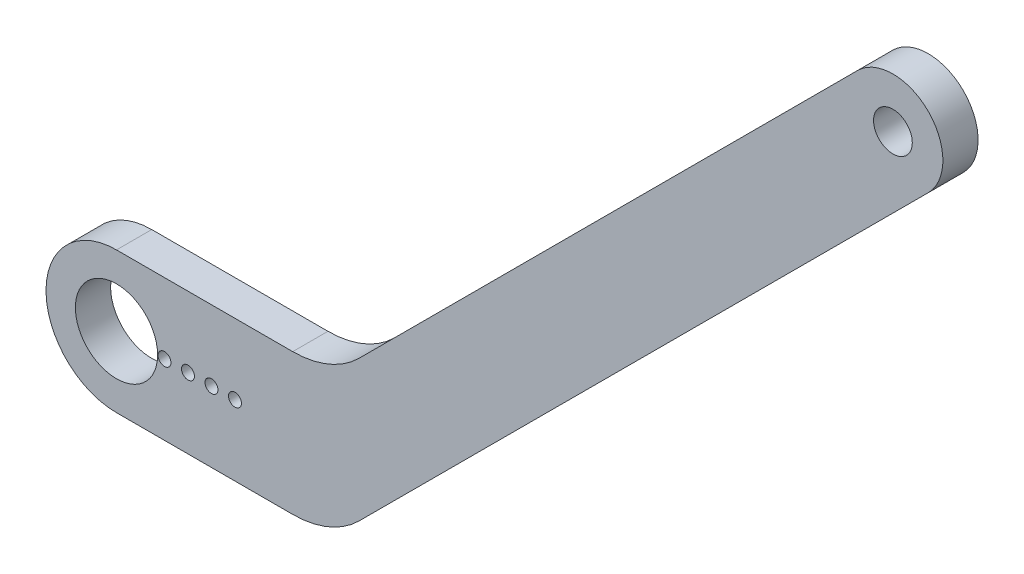
ISO-10303-21;
HEADER;
FILE_DESCRIPTION(('STEP AP214'),'2;1');
FILE_NAME('part.step','',(''),(''),'','','');
FILE_SCHEMA(('AUTOMOTIVE_DESIGN { 1 0 10303 214 1 1 1 1 }'));
ENDSEC;
DATA;
#1=APPLICATION_CONTEXT('core data for automotive mechanical design processes');
#2=APPLICATION_PROTOCOL_DEFINITION('international standard','automotive_design',2000,#1);
#3=PRODUCT_CONTEXT('',#1,'mechanical');
#4=PRODUCT('Part','Part','',(#3));
#5=PRODUCT_RELATED_PRODUCT_CATEGORY('part','',(#4));
#6=PRODUCT_DEFINITION_FORMATION('','',#4);
#7=PRODUCT_DEFINITION_CONTEXT('part definition',#1,'design');
#8=PRODUCT_DEFINITION('design','',#6,#7);
#9=PRODUCT_DEFINITION_SHAPE('','',#8);
#10=(LENGTH_UNIT() NAMED_UNIT(*) SI_UNIT(.MILLI.,.METRE.));
#11=(NAMED_UNIT(*) PLANE_ANGLE_UNIT() SI_UNIT($,.RADIAN.));
#12=(NAMED_UNIT(*) SI_UNIT($,.STERADIAN.) SOLID_ANGLE_UNIT());
#13=UNCERTAINTY_MEASURE_WITH_UNIT(LENGTH_MEASURE(1.E-05),#10,'distance_accuracy_value','');
#14=(GEOMETRIC_REPRESENTATION_CONTEXT(3) GLOBAL_UNCERTAINTY_ASSIGNED_CONTEXT((#13)) GLOBAL_UNIT_ASSIGNED_CONTEXT((#10,
#11,#12)) REPRESENTATION_CONTEXT('',''));
#15=CARTESIAN_POINT('',(0.,0.,0.));
#16=DIRECTION('',(0.,0.,1.));
#17=DIRECTION('',(1.,0.,0.));
#18=AXIS2_PLACEMENT_3D('',#15,#16,#17);
#19=CARTESIAN_POINT('',(66.088464940728,47.7643488016577,3.));
#20=DIRECTION('',(0.,0.,-1.));
#21=DIRECTION('',(-1.,0.,0.));
#22=AXIS2_PLACEMENT_3D('',#19,#20,#21);
#23=CYLINDRICAL_SURFACE('',#22,4.25000000000001);
#24=CARTESIAN_POINT('',(66.088464940728,47.7643488016577,0.));
#25=DIRECTION('',(0.,0.,1.));
#26=DIRECTION('',(1.,0.,0.));
#27=AXIS2_PLACEMENT_3D('',#24,#25,#26);
#28=CIRCLE('',#27,4.25000000000001);
#29=CARTESIAN_POINT('',(63.0832611206852,50.7695526217005,0.));
#30=VERTEX_POINT('',#29);
#31=CARTESIAN_POINT('',(69.0936687607709,44.7591449816148,0.));
#32=VERTEX_POINT('',#31);
#33=EDGE_CURVE('E145',#30,#32,#28,.F.);
#34=ORIENTED_EDGE('',*,*,#33,.F.);
#35=DIRECTION('',(0.,0.,-1.));
#36=VECTOR('',#35,1.);
#37=CARTESIAN_POINT('',(63.0832611206852,50.7695526217005,3.));
#38=LINE('',#37,#36);
#39=CARTESIAN_POINT('',(63.0832611206852,50.7695526217005,3.));
#40=VERTEX_POINT('',#39);
#41=EDGE_CURVE('E11',#40,#30,#38,.T.);
#42=ORIENTED_EDGE('',*,*,#41,.F.);
#43=CARTESIAN_POINT('',(66.088464940728,47.7643488016577,3.));
#44=DIRECTION('',(0.,0.,1.));
#45=DIRECTION('',(1.,0.,0.));
#46=AXIS2_PLACEMENT_3D('',#43,#44,#45);
#47=CIRCLE('',#46,4.25000000000001);
#48=CARTESIAN_POINT('',(69.0936687607709,44.7591449816148,3.));
#49=VERTEX_POINT('',#48);
#50=EDGE_CURVE('E165',#40,#49,#47,.F.);
#51=ORIENTED_EDGE('',*,*,#50,.T.);
#52=DIRECTION('',(0.,0.,-1.));
#53=VECTOR('',#52,1.);
#54=CARTESIAN_POINT('',(69.0936687607709,44.7591449816148,3.));
#55=LINE('',#54,#53);
#56=EDGE_CURVE('E94',#49,#32,#55,.T.);
#57=ORIENTED_EDGE('',*,*,#56,.T.);
#58=EDGE_LOOP('',(#34,#42,#51,#57));
#59=FACE_BOUND('',#58,.T.);
#60=ADVANCED_FACE('F37',(#59),#23,.T.);
#61=CARTESIAN_POINT('',(6.15685424949239,-6.15685424949239,3.));
#62=DIRECTION('',(0.707106781186548,-0.707106781186547,0.));
#63=DIRECTION('',(0.707106781186547,0.707106781186548,0.));
#64=AXIS2_PLACEMENT_3D('',#61,#62,#63);
#65=PLANE('',#64);
#66=DIRECTION('',(-0.707106781186547,-0.707106781186548,0.));
#67=VECTOR('',#66,1.);
#68=CARTESIAN_POINT('',(6.15685424949239,-6.15685424949239,0.));
#69=LINE('',#68,#67);
#70=CARTESIAN_POINT('',(20.6568542494924,8.34314575050763,0.));
#71=VERTEX_POINT('',#70);
#72=EDGE_CURVE('E148',#30,#71,#69,.T.);
#73=ORIENTED_EDGE('',*,*,#72,.T.);
#74=DIRECTION('',(0.,0.,-1.));
#75=VECTOR('',#74,1.);
#76=CARTESIAN_POINT('',(20.6568542494924,8.34314575050763,3.));
#77=LINE('',#76,#75);
#78=CARTESIAN_POINT('',(20.6568542494924,8.34314575050763,3.));
#79=VERTEX_POINT('',#78);
#80=EDGE_CURVE('E45',#79,#71,#77,.T.);
#81=ORIENTED_EDGE('',*,*,#80,.F.);
#82=DIRECTION('',(-0.707106781186547,-0.707106781186548,0.));
#83=VECTOR('',#82,1.);
#84=CARTESIAN_POINT('',(6.15685424949239,-6.15685424949239,3.));
#85=LINE('',#84,#83);
#86=EDGE_CURVE('E224',#40,#79,#85,.T.);
#87=ORIENTED_EDGE('',*,*,#86,.F.);
#88=ORIENTED_EDGE('',*,*,#41,.T.);
#89=EDGE_LOOP('',(#73,#81,#87,#88));
#90=FACE_BOUND('',#89,.T.);
#91=ADVANCED_FACE('F254',(#90),#65,.F.);
#92=CARTESIAN_POINT('',(14.9997500117588,13.9997500007108,3.));
#93=DIRECTION('',(0.,0.,-1.));
#94=DIRECTION('',(-1.,0.,0.));
#95=AXIS2_PLACEMENT_3D('',#92,#93,#94);
#96=CYLINDRICAL_SURFACE('',#95,8.00000000000001);
#97=CARTESIAN_POINT('',(14.9997500117588,13.9997500007108,0.));
#98=DIRECTION('',(0.,0.,1.));
#99=DIRECTION('',(1.,0.,0.));
#100=AXIS2_PLACEMENT_3D('',#97,#98,#99);
#101=CIRCLE('',#100,8.00000000000001);
#102=CARTESIAN_POINT('',(14.9997500117588,5.99975000071084,0.));
#103=VERTEX_POINT('',#102);
#104=EDGE_CURVE('E152',#103,#71,#101,.T.);
#105=ORIENTED_EDGE('',*,*,#104,.F.);
#106=DIRECTION('',(0.,0.,-1.));
#107=VECTOR('',#106,1.);
#108=CARTESIAN_POINT('',(14.9997500117588,5.99975000071084,3.));
#109=LINE('',#108,#107);
#110=CARTESIAN_POINT('',(14.9997500117588,5.99975000071084,3.));
#111=VERTEX_POINT('',#110);
#112=EDGE_CURVE('E171',#111,#103,#109,.T.);
#113=ORIENTED_EDGE('',*,*,#112,.F.);
#114=CARTESIAN_POINT('',(14.9997500117588,13.9997500007108,3.));
#115=DIRECTION('',(0.,0.,1.));
#116=DIRECTION('',(1.,0.,0.));
#117=AXIS2_PLACEMENT_3D('',#114,#115,#116);
#118=CIRCLE('',#117,8.00000000000001);
#119=EDGE_CURVE('E226',#111,#79,#118,.T.);
#120=ORIENTED_EDGE('',*,*,#119,.T.);
#121=ORIENTED_EDGE('',*,*,#80,.T.);
#122=EDGE_LOOP('',(#105,#113,#120,#121));
#123=FACE_BOUND('',#122,.T.);
#124=ADVANCED_FACE('F238',(#123),#96,.F.);
#125=CARTESIAN_POINT('',(0.,5.99975000071084,3.));
#126=DIRECTION('',(0.,1.,0.));
#127=DIRECTION('',(-1.,0.,0.));
#128=AXIS2_PLACEMENT_3D('',#125,#126,#127);
#129=PLANE('',#128);
#130=DIRECTION('',(1.,0.,0.));
#131=VECTOR('',#130,1.);
#132=CARTESIAN_POINT('',(0.,5.99975000071084,0.));
#133=LINE('',#132,#131);
#134=CARTESIAN_POINT('',(0.000249999289151017,5.99975000071084,0.));
#135=VERTEX_POINT('',#134);
#136=EDGE_CURVE('E155',#135,#103,#133,.T.);
#137=ORIENTED_EDGE('',*,*,#136,.F.);
#138=DIRECTION('',(0.,0.,-1.));
#139=VECTOR('',#138,1.);
#140=CARTESIAN_POINT('',(0.000249999289151017,5.99975000071084,3.));
#141=LINE('',#140,#139);
#142=CARTESIAN_POINT('',(0.000249999289151017,5.99975000071084,3.));
#143=VERTEX_POINT('',#142);
#144=EDGE_CURVE('E169',#143,#135,#141,.T.);
#145=ORIENTED_EDGE('',*,*,#144,.F.);
#146=DIRECTION('',(1.,0.,0.));
#147=VECTOR('',#146,1.);
#148=CARTESIAN_POINT('',(0.,5.99975000071084,3.));
#149=LINE('',#148,#147);
#150=EDGE_CURVE('E229',#143,#111,#149,.T.);
#151=ORIENTED_EDGE('',*,*,#150,.T.);
#152=ORIENTED_EDGE('',*,*,#112,.T.);
#153=EDGE_LOOP('',(#137,#145,#151,#152));
#154=FACE_BOUND('',#153,.T.);
#155=ADVANCED_FACE('F233',(#154),#129,.T.);
#156=CARTESIAN_POINT('',(0.000249999289151017,-0.000249999289158823,3.));
#157=DIRECTION('',(0.,0.,-1.));
#158=DIRECTION('',(-1.,0.,0.));
#159=AXIS2_PLACEMENT_3D('',#156,#157,#158);
#160=CYLINDRICAL_SURFACE('',#159,6.);
#161=CARTESIAN_POINT('',(0.000249999289151017,-0.000249999289158823,0.));
#162=DIRECTION('',(0.,0.,1.));
#163=DIRECTION('',(1.,0.,0.));
#164=AXIS2_PLACEMENT_3D('',#161,#162,#163);
#165=CIRCLE('',#164,6.);
#166=CARTESIAN_POINT('',(0.000249999289151017,-6.00024999928916,0.));
#167=VERTEX_POINT('',#166);
#168=EDGE_CURVE('E158',#135,#167,#165,.T.);
#169=ORIENTED_EDGE('',*,*,#168,.T.);
#170=DIRECTION('',(0.,0.,-1.));
#171=VECTOR('',#170,1.);
#172=CARTESIAN_POINT('',(0.000249999289151017,-6.00024999928916,3.));
#173=LINE('',#172,#171);
#174=CARTESIAN_POINT('',(0.000249999289151017,-6.00024999928916,3.));
#175=VERTEX_POINT('',#174);
#176=EDGE_CURVE('E136',#175,#167,#173,.T.);
#177=ORIENTED_EDGE('',*,*,#176,.F.);
#178=CARTESIAN_POINT('',(0.000249999289151017,-0.000249999289158823,3.));
#179=DIRECTION('',(0.,0.,1.));
#180=DIRECTION('',(1.,0.,0.));
#181=AXIS2_PLACEMENT_3D('',#178,#179,#180);
#182=CIRCLE('',#181,6.);
#183=EDGE_CURVE('E124',#143,#175,#182,.T.);
#184=ORIENTED_EDGE('',*,*,#183,.F.);
#185=ORIENTED_EDGE('',*,*,#144,.T.);
#186=EDGE_LOOP('',(#169,#177,#184,#185));
#187=FACE_BOUND('',#186,.T.);
#188=ADVANCED_FACE('F244',(#187),#160,.T.);
#189=CARTESIAN_POINT('',(0.,-6.00024999928916,3.));
#190=DIRECTION('',(0.,1.,0.));
#191=DIRECTION('',(-1.,0.,0.));
#192=AXIS2_PLACEMENT_3D('',#189,#190,#191);
#193=PLANE('',#192);
#194=DIRECTION('',(1.,0.,0.));
#195=VECTOR('',#194,1.);
#196=CARTESIAN_POINT('',(0.,-6.00024999928916,0.));
#197=LINE('',#196,#195);
#198=CARTESIAN_POINT('',(14.9918677418608,-6.00024999928916,0.));
#199=VERTEX_POINT('',#198);
#200=EDGE_CURVE('E133',#167,#199,#197,.T.);
#201=ORIENTED_EDGE('',*,*,#200,.T.);
#202=DIRECTION('',(0.,0.,-1.));
#203=VECTOR('',#202,1.);
#204=CARTESIAN_POINT('',(14.9918677418608,-6.00024999928916,3.));
#205=LINE('',#204,#203);
#206=CARTESIAN_POINT('',(14.9918677418608,-6.00024999928916,3.));
#207=VERTEX_POINT('',#206);
#208=EDGE_CURVE('E130',#207,#199,#205,.T.);
#209=ORIENTED_EDGE('',*,*,#208,.F.);
#210=DIRECTION('',(1.,0.,0.));
#211=VECTOR('',#210,1.);
#212=CARTESIAN_POINT('',(0.,-6.00024999928916,3.));
#213=LINE('',#212,#211);
#214=EDGE_CURVE('E116',#175,#207,#213,.T.);
#215=ORIENTED_EDGE('',*,*,#214,.F.);
#216=ORIENTED_EDGE('',*,*,#176,.T.);
#217=EDGE_LOOP('',(#201,#209,#215,#216));
#218=FACE_BOUND('',#217,.T.);
#219=ADVANCED_FACE('F131',(#218),#193,.F.);
#220=CARTESIAN_POINT('',(14.9918677418608,1.99975000071084,3.));
#221=DIRECTION('',(0.,0.,-1.));
#222=DIRECTION('',(-1.,0.,0.));
#223=AXIS2_PLACEMENT_3D('',#220,#221,#222);
#224=CYLINDRICAL_SURFACE('',#223,8.00000000000001);
#225=CARTESIAN_POINT('',(14.9918677418608,1.99975000071084,0.));
#226=DIRECTION('',(0.,0.,1.));
#227=DIRECTION('',(1.,0.,0.));
#228=AXIS2_PLACEMENT_3D('',#225,#226,#227);
#229=CIRCLE('',#228,8.00000000000001);
#230=CARTESIAN_POINT('',(20.6470457883556,-3.65877995524446,0.));
#231=VERTEX_POINT('',#230);
#232=EDGE_CURVE('E161',#199,#231,#229,.T.);
#233=ORIENTED_EDGE('',*,*,#232,.T.);
#234=DIRECTION('',(0.,0.,-1.));
#235=VECTOR('',#234,1.);
#236=CARTESIAN_POINT('',(20.6470457883556,-3.65877995524446,3.));
#237=LINE('',#236,#235);
#238=CARTESIAN_POINT('',(20.6470457883556,-3.65877995524446,3.));
#239=VERTEX_POINT('',#238);
#240=EDGE_CURVE('E137',#239,#231,#237,.T.);
#241=ORIENTED_EDGE('',*,*,#240,.F.);
#242=CARTESIAN_POINT('',(14.9918677418608,1.99975000071084,3.));
#243=DIRECTION('',(0.,0.,1.));
#244=DIRECTION('',(1.,0.,0.));
#245=AXIS2_PLACEMENT_3D('',#242,#243,#244);
#246=CIRCLE('',#245,8.00000000000001);
#247=EDGE_CURVE('E120',#207,#239,#246,.T.);
#248=ORIENTED_EDGE('',*,*,#247,.F.);
#249=ORIENTED_EDGE('',*,*,#208,.T.);
#250=EDGE_LOOP('',(#233,#241,#248,#249));
#251=FACE_BOUND('',#250,.T.);
#252=ADVANCED_FACE('F139',(#251),#224,.T.);
#253=CARTESIAN_POINT('',(12.1467954560561,-12.1539950452236,3.));
#254=DIRECTION('',(-0.706897255811848,0.707316244494411,0.));
#255=DIRECTION('',(-0.707316244494412,-0.706897255811848,0.));
#256=AXIS2_PLACEMENT_3D('',#253,#254,#255);
#257=PLANE('',#256);
#258=DIRECTION('',(0.707316244494412,0.706897255811848,0.));
#259=VECTOR('',#258,1.);
#260=CARTESIAN_POINT('',(12.1467954560561,-12.1539950452236,0.));
#261=LINE('',#260,#259);
#262=EDGE_CURVE('E163',#231,#32,#261,.T.);
#263=ORIENTED_EDGE('',*,*,#262,.T.);
#264=ORIENTED_EDGE('',*,*,#56,.F.);
#265=DIRECTION('',(0.707316244494412,0.706897255811848,0.));
#266=VECTOR('',#265,1.);
#267=CARTESIAN_POINT('',(12.1467954560561,-12.1539950452236,3.));
#268=LINE('',#267,#266);
#269=EDGE_CURVE('E62',#239,#49,#268,.T.);
#270=ORIENTED_EDGE('',*,*,#269,.F.);
#271=ORIENTED_EDGE('',*,*,#240,.T.);
#272=EDGE_LOOP('',(#263,#264,#270,#271));
#273=FACE_BOUND('',#272,.T.);
#274=ADVANCED_FACE('F261',(#273),#257,.F.);
#275=CARTESIAN_POINT('',(0.,0.,3.));
#276=DIRECTION('',(0.,0.,1.));
#277=DIRECTION('',(1.,0.,0.));
#278=AXIS2_PLACEMENT_3D('',#275,#276,#277);
#279=PLANE('',#278);
#280=CARTESIAN_POINT('',(4.085,0.,3.));
#281=DIRECTION('',(0.,0.,1.));
#282=DIRECTION('',(1.,0.,0.));
#283=AXIS2_PLACEMENT_3D('',#280,#281,#282);
#284=CIRCLE('',#283,0.55);
#285=CARTESIAN_POINT('',(4.635,0.,3.));
#286=VERTEX_POINT('',#285);
#287=EDGE_CURVE('E184',#286,#286,#284,.T.);
#288=ORIENTED_EDGE('',*,*,#287,.F.);
#289=EDGE_LOOP('',(#288));
#290=FACE_BOUND('',#289,.T.);
#291=CARTESIAN_POINT('',(6.085,0.,3.));
#292=DIRECTION('',(0.,0.,1.));
#293=DIRECTION('',(1.,0.,0.));
#294=AXIS2_PLACEMENT_3D('',#291,#292,#293);
#295=CIRCLE('',#294,0.55);
#296=CARTESIAN_POINT('',(6.635,0.,3.));
#297=VERTEX_POINT('',#296);
#298=EDGE_CURVE('E318',#297,#297,#295,.T.);
#299=ORIENTED_EDGE('',*,*,#298,.F.);
#300=EDGE_LOOP('',(#299));
#301=FACE_BOUND('',#300,.T.);
#302=CARTESIAN_POINT('',(8.085,0.,3.));
#303=DIRECTION('',(0.,0.,1.));
#304=DIRECTION('',(1.,0.,0.));
#305=AXIS2_PLACEMENT_3D('',#302,#303,#304);
#306=CIRCLE('',#305,0.550000000000001);
#307=CARTESIAN_POINT('',(8.635,0.,3.));
#308=VERTEX_POINT('',#307);
#309=EDGE_CURVE('E321',#308,#308,#306,.T.);
#310=ORIENTED_EDGE('',*,*,#309,.F.);
#311=EDGE_LOOP('',(#310));
#312=FACE_BOUND('',#311,.T.);
#313=CARTESIAN_POINT('',(10.085,0.,3.));
#314=DIRECTION('',(0.,0.,1.));
#315=DIRECTION('',(1.,0.,0.));
#316=AXIS2_PLACEMENT_3D('',#313,#314,#315);
#317=CIRCLE('',#316,0.55);
#318=CARTESIAN_POINT('',(10.635,0.,3.));
#319=VERTEX_POINT('',#318);
#320=EDGE_CURVE('E326',#319,#319,#317,.T.);
#321=ORIENTED_EDGE('',*,*,#320,.F.);
#322=EDGE_LOOP('',(#321));
#323=FACE_BOUND('',#322,.T.);
#324=CARTESIAN_POINT('',(0.,0.,3.));
#325=DIRECTION('',(0.,0.,1.));
#326=DIRECTION('',(1.,0.,0.));
#327=AXIS2_PLACEMENT_3D('',#324,#325,#326);
#328=CIRCLE('',#327,3.5);
#329=CARTESIAN_POINT('',(3.5,0.,3.));
#330=VERTEX_POINT('',#329);
#331=EDGE_CURVE('E177',#330,#330,#328,.T.);
#332=ORIENTED_EDGE('',*,*,#331,.F.);
#333=EDGE_LOOP('',(#332));
#334=FACE_BOUND('',#333,.T.);
#335=CARTESIAN_POINT('',(66.088464940728,47.7643488016577,3.));
#336=DIRECTION('',(0.,0.,1.));
#337=DIRECTION('',(1.,0.,0.));
#338=AXIS2_PLACEMENT_3D('',#335,#336,#337);
#339=CIRCLE('',#338,1.65);
#340=CARTESIAN_POINT('',(67.738464940728,47.7643488016577,3.));
#341=VERTEX_POINT('',#340);
#342=EDGE_CURVE('E210',#341,#341,#339,.T.);
#343=ORIENTED_EDGE('',*,*,#342,.F.);
#344=EDGE_LOOP('',(#343));
#345=FACE_BOUND('',#344,.T.);
#346=ORIENTED_EDGE('',*,*,#50,.F.);
#347=ORIENTED_EDGE('',*,*,#86,.T.);
#348=ORIENTED_EDGE('',*,*,#119,.F.);
#349=ORIENTED_EDGE('',*,*,#150,.F.);
#350=ORIENTED_EDGE('',*,*,#183,.T.);
#351=ORIENTED_EDGE('',*,*,#214,.T.);
#352=ORIENTED_EDGE('',*,*,#247,.T.);
#353=ORIENTED_EDGE('',*,*,#269,.T.);
#354=EDGE_LOOP('',(#346,#347,#348,#349,#350,#351,#352,#353));
#355=FACE_BOUND('',#354,.T.);
#356=ADVANCED_FACE('F118',(#290,#301,#312,#323,#334,#345,#355),#279,.T.);
#357=CARTESIAN_POINT('',(0.,0.,0.));
#358=DIRECTION('',(0.,0.,1.));
#359=DIRECTION('',(1.,0.,0.));
#360=AXIS2_PLACEMENT_3D('',#357,#358,#359);
#361=PLANE('',#360);
#362=CARTESIAN_POINT('',(0.,0.,0.));
#363=DIRECTION('',(0.,0.,1.));
#364=DIRECTION('',(1.,0.,0.));
#365=AXIS2_PLACEMENT_3D('',#362,#363,#364);
#366=CIRCLE('',#365,3.5);
#367=CARTESIAN_POINT('',(2.16820380387266,2.74752475236751,0.));
#368=VERTEX_POINT('',#367);
#369=CARTESIAN_POINT('',(2.16820380387264,-2.74752475236753,0.));
#370=VERTEX_POINT('',#369);
#371=EDGE_CURVE('E149',#368,#370,#366,.T.);
#372=ORIENTED_EDGE('',*,*,#371,.T.);
#373=DIRECTION('',(0.997762365610376,0.0668600162398011,0.));
#374=VECTOR('',#373,1.);
#375=CARTESIAN_POINT('',(0.192980935710549,-2.87988435781502,0.));
#376=LINE('',#375,#374);
#377=CARTESIAN_POINT('',(14.2,-1.94127457016614,0.));
#378=VERTEX_POINT('',#377);
#379=EDGE_CURVE('E201',#370,#378,#376,.T.);
#380=ORIENTED_EDGE('',*,*,#379,.T.);
#381=CARTESIAN_POINT('',(14.0270915846211,-0.191274570166139,0.));
#382=DIRECTION('',(0.,0.,1.));
#383=DIRECTION('',(1.,0.,0.));
#384=AXIS2_PLACEMENT_3D('',#381,#382,#383);
#385=CIRCLE('',#384,1.75852134479762);
#386=CARTESIAN_POINT('',(14.2,1.55872542983386,0.));
#387=VERTEX_POINT('',#386);
#388=EDGE_CURVE('E206',#387,#378,#385,.F.);
#389=ORIENTED_EDGE('',*,*,#388,.F.);
#390=DIRECTION('',(0.995154255691675,-0.0983260259481059,0.));
#391=VECTOR('',#390,1.);
#392=CARTESIAN_POINT('',(0.289806307185545,2.9331194578554,0.));
#393=LINE('',#392,#391);
#394=EDGE_CURVE('E330',#368,#387,#393,.T.);
#395=ORIENTED_EDGE('',*,*,#394,.F.);
#396=EDGE_LOOP('',(#372,#380,#389,#395));
#397=FACE_BOUND('',#396,.T.);
#398=CARTESIAN_POINT('',(66.088464940728,47.7643488016577,0.));
#399=DIRECTION('',(0.,0.,1.));
#400=DIRECTION('',(1.,0.,0.));
#401=AXIS2_PLACEMENT_3D('',#398,#399,#400);
#402=CIRCLE('',#401,1.65);
#403=CARTESIAN_POINT('',(67.738464940728,47.7643488016577,0.));
#404=VERTEX_POINT('',#403);
#405=EDGE_CURVE('E174',#404,#404,#402,.T.);
#406=ORIENTED_EDGE('',*,*,#405,.T.);
#407=EDGE_LOOP('',(#406));
#408=FACE_BOUND('',#407,.T.);
#409=ORIENTED_EDGE('',*,*,#33,.T.);
#410=ORIENTED_EDGE('',*,*,#262,.F.);
#411=ORIENTED_EDGE('',*,*,#232,.F.);
#412=ORIENTED_EDGE('',*,*,#200,.F.);
#413=ORIENTED_EDGE('',*,*,#168,.F.);
#414=ORIENTED_EDGE('',*,*,#136,.T.);
#415=ORIENTED_EDGE('',*,*,#104,.T.);
#416=ORIENTED_EDGE('',*,*,#72,.F.);
#417=EDGE_LOOP('',(#409,#410,#411,#412,#413,#414,#415,#416));
#418=FACE_BOUND('',#417,.T.);
#419=ADVANCED_FACE('F242',(#397,#408,#418),#361,.F.);
#420=CARTESIAN_POINT('',(66.088464940728,47.7643488016577,-3.));
#421=DIRECTION('',(0.,0.,1.));
#422=DIRECTION('',(1.,0.,0.));
#423=AXIS2_PLACEMENT_3D('',#420,#421,#422);
#424=CYLINDRICAL_SURFACE('',#423,1.65);
#425=ORIENTED_EDGE('',*,*,#342,.T.);
#426=EDGE_LOOP('',(#425));
#427=FACE_BOUND('',#426,.T.);
#428=ORIENTED_EDGE('',*,*,#405,.F.);
#429=EDGE_LOOP('',(#428));
#430=FACE_BOUND('',#429,.T.);
#431=ADVANCED_FACE('F273',(#427,#430),#424,.F.);
#432=CARTESIAN_POINT('',(0.,0.,-3.));
#433=DIRECTION('',(0.,0.,1.));
#434=DIRECTION('',(1.,0.,0.));
#435=AXIS2_PLACEMENT_3D('',#432,#433,#434);
#436=CYLINDRICAL_SURFACE('',#435,3.5);
#437=CARTESIAN_POINT('',(0.,0.,2.));
#438=DIRECTION('',(0.,0.,1.));
#439=DIRECTION('',(1.,0.,0.));
#440=AXIS2_PLACEMENT_3D('',#437,#438,#439);
#441=CIRCLE('',#440,3.5);
#442=CARTESIAN_POINT('',(2.16820380387264,-2.74752475236753,2.));
#443=VERTEX_POINT('',#442);
#444=CARTESIAN_POINT('',(2.16820380387266,2.74752475236751,2.));
#445=VERTEX_POINT('',#444);
#446=EDGE_CURVE('E198',#443,#445,#441,.T.);
#447=ORIENTED_EDGE('',*,*,#446,.F.);
#448=DIRECTION('',(0.,0.,1.));
#449=VECTOR('',#448,1.);
#450=CARTESIAN_POINT('',(2.16820380387264,-2.74752475236753,0.));
#451=LINE('',#450,#449);
#452=EDGE_CURVE('E211',#370,#443,#451,.T.);
#453=ORIENTED_EDGE('',*,*,#452,.F.);
#454=ORIENTED_EDGE('',*,*,#371,.F.);
#455=DIRECTION('',(0.,0.,1.));
#456=VECTOR('',#455,1.);
#457=CARTESIAN_POINT('',(2.16820380387266,2.74752475236751,0.));
#458=LINE('',#457,#456);
#459=EDGE_CURVE('E213',#368,#445,#458,.T.);
#460=ORIENTED_EDGE('',*,*,#459,.T.);
#461=EDGE_LOOP('',(#447,#453,#454,#460));
#462=FACE_BOUND('',#461,.T.);
#463=ORIENTED_EDGE('',*,*,#331,.T.);
#464=EDGE_LOOP('',(#463));
#465=FACE_BOUND('',#464,.T.);
#466=ADVANCED_FACE('F278',(#462,#465),#436,.F.);
#467=CARTESIAN_POINT('',(14.0270915846211,-0.191274570166139,0.));
#468=DIRECTION('',(0.,0.,1.));
#469=DIRECTION('',(1.,0.,0.));
#470=AXIS2_PLACEMENT_3D('',#467,#468,#469);
#471=CYLINDRICAL_SURFACE('',#470,1.75852134479762);
#472=CARTESIAN_POINT('',(14.0270915846211,-0.191274570166139,2.));
#473=DIRECTION('',(0.,0.,1.));
#474=DIRECTION('',(1.,0.,0.));
#475=AXIS2_PLACEMENT_3D('',#472,#473,#474);
#476=CIRCLE('',#475,1.75852134479762);
#477=CARTESIAN_POINT('',(14.2,1.55872542983386,2.));
#478=VERTEX_POINT('',#477);
#479=CARTESIAN_POINT('',(14.2,-1.94127457016614,2.));
#480=VERTEX_POINT('',#479);
#481=EDGE_CURVE('E191',#478,#480,#476,.F.);
#482=ORIENTED_EDGE('',*,*,#481,.F.);
#483=DIRECTION('',(0.,0.,1.));
#484=VECTOR('',#483,1.);
#485=CARTESIAN_POINT('',(14.2,1.55872542983386,0.));
#486=LINE('',#485,#484);
#487=EDGE_CURVE('E216',#387,#478,#486,.T.);
#488=ORIENTED_EDGE('',*,*,#487,.F.);
#489=ORIENTED_EDGE('',*,*,#388,.T.);
#490=DIRECTION('',(0.,0.,1.));
#491=VECTOR('',#490,1.);
#492=CARTESIAN_POINT('',(14.2,-1.94127457016614,0.));
#493=LINE('',#492,#491);
#494=EDGE_CURVE('E207',#378,#480,#493,.T.);
#495=ORIENTED_EDGE('',*,*,#494,.T.);
#496=EDGE_LOOP('',(#482,#488,#489,#495));
#497=FACE_BOUND('',#496,.T.);
#498=ADVANCED_FACE('F282',(#497),#471,.F.);
#499=CARTESIAN_POINT('',(0.192980935710549,-2.87988435781502,0.));
#500=DIRECTION('',(0.0668600162398011,-0.997762365610376,0.));
#501=DIRECTION('',(0.997762365610376,0.0668600162398011,0.));
#502=AXIS2_PLACEMENT_3D('',#499,#500,#501);
#503=PLANE('',#502);
#504=DIRECTION('',(0.997762365610376,0.0668600162398011,0.));
#505=VECTOR('',#504,1.);
#506=CARTESIAN_POINT('',(0.192980935710549,-2.87988435781502,2.));
#507=LINE('',#506,#505);
#508=EDGE_CURVE('E53',#443,#480,#507,.T.);
#509=ORIENTED_EDGE('',*,*,#508,.T.);
#510=ORIENTED_EDGE('',*,*,#494,.F.);
#511=ORIENTED_EDGE('',*,*,#379,.F.);
#512=ORIENTED_EDGE('',*,*,#452,.T.);
#513=EDGE_LOOP('',(#509,#510,#511,#512));
#514=FACE_BOUND('',#513,.T.);
#515=ADVANCED_FACE('F286',(#514),#503,.F.);
#516=CARTESIAN_POINT('',(0.289806307185545,2.9331194578554,0.));
#517=DIRECTION('',(-0.0983260259481059,-0.995154255691675,0.));
#518=DIRECTION('',(0.995154255691675,-0.0983260259481059,0.));
#519=AXIS2_PLACEMENT_3D('',#516,#517,#518);
#520=PLANE('',#519);
#521=DIRECTION('',(0.995154255691675,-0.0983260259481059,0.));
#522=VECTOR('',#521,1.);
#523=CARTESIAN_POINT('',(0.289806307185545,2.9331194578554,2.));
#524=LINE('',#523,#522);
#525=EDGE_CURVE('E194',#445,#478,#524,.T.);
#526=ORIENTED_EDGE('',*,*,#525,.F.);
#527=ORIENTED_EDGE('',*,*,#459,.F.);
#528=ORIENTED_EDGE('',*,*,#394,.T.);
#529=ORIENTED_EDGE('',*,*,#487,.T.);
#530=EDGE_LOOP('',(#526,#527,#528,#529));
#531=FACE_BOUND('',#530,.T.);
#532=ADVANCED_FACE('F288',(#531),#520,.T.);
#533=CARTESIAN_POINT('',(0.,0.,2.));
#534=DIRECTION('',(0.,0.,1.));
#535=DIRECTION('',(1.,0.,0.));
#536=AXIS2_PLACEMENT_3D('',#533,#534,#535);
#537=PLANE('',#536);
#538=CARTESIAN_POINT('',(4.085,0.,2.));
#539=DIRECTION('',(0.,0.,1.));
#540=DIRECTION('',(1.,0.,0.));
#541=AXIS2_PLACEMENT_3D('',#538,#539,#540);
#542=CIRCLE('',#541,0.55);
#543=CARTESIAN_POINT('',(4.635,0.,2.));
#544=VERTEX_POINT('',#543);
#545=EDGE_CURVE('E40',#544,#544,#542,.T.);
#546=ORIENTED_EDGE('',*,*,#545,.T.);
#547=EDGE_LOOP('',(#546));
#548=FACE_BOUND('',#547,.T.);
#549=CARTESIAN_POINT('',(6.085,0.,2.));
#550=DIRECTION('',(0.,0.,1.));
#551=DIRECTION('',(1.,0.,0.));
#552=AXIS2_PLACEMENT_3D('',#549,#550,#551);
#553=CIRCLE('',#552,0.55);
#554=CARTESIAN_POINT('',(6.635,0.,2.));
#555=VERTEX_POINT('',#554);
#556=EDGE_CURVE('E186',#555,#555,#553,.T.);
#557=ORIENTED_EDGE('',*,*,#556,.T.);
#558=EDGE_LOOP('',(#557));
#559=FACE_BOUND('',#558,.T.);
#560=CARTESIAN_POINT('',(8.085,0.,2.));
#561=DIRECTION('',(0.,0.,1.));
#562=DIRECTION('',(1.,0.,0.));
#563=AXIS2_PLACEMENT_3D('',#560,#561,#562);
#564=CIRCLE('',#563,0.550000000000001);
#565=CARTESIAN_POINT('',(8.635,0.,2.));
#566=VERTEX_POINT('',#565);
#567=EDGE_CURVE('E183',#566,#566,#564,.T.);
#568=ORIENTED_EDGE('',*,*,#567,.T.);
#569=EDGE_LOOP('',(#568));
#570=FACE_BOUND('',#569,.T.);
#571=CARTESIAN_POINT('',(10.085,0.,2.));
#572=DIRECTION('',(0.,0.,1.));
#573=DIRECTION('',(1.,0.,0.));
#574=AXIS2_PLACEMENT_3D('',#571,#572,#573);
#575=CIRCLE('',#574,0.55);
#576=CARTESIAN_POINT('',(10.635,0.,2.));
#577=VERTEX_POINT('',#576);
#578=EDGE_CURVE('E180',#577,#577,#575,.T.);
#579=ORIENTED_EDGE('',*,*,#578,.T.);
#580=EDGE_LOOP('',(#579));
#581=FACE_BOUND('',#580,.T.);
#582=ORIENTED_EDGE('',*,*,#481,.T.);
#583=ORIENTED_EDGE('',*,*,#508,.F.);
#584=ORIENTED_EDGE('',*,*,#446,.T.);
#585=ORIENTED_EDGE('',*,*,#525,.T.);
#586=EDGE_LOOP('',(#582,#583,#584,#585));
#587=FACE_BOUND('',#586,.T.);
#588=ADVANCED_FACE('F291',(#548,#559,#570,#581,#587),#537,.F.);
#589=CARTESIAN_POINT('',(10.085,0.,0.));
#590=DIRECTION('',(0.,0.,1.));
#591=DIRECTION('',(1.,0.,0.));
#592=AXIS2_PLACEMENT_3D('',#589,#590,#591);
#593=CYLINDRICAL_SURFACE('',#592,0.55);
#594=ORIENTED_EDGE('',*,*,#320,.T.);
#595=EDGE_LOOP('',(#594));
#596=FACE_BOUND('',#595,.T.);
#597=ORIENTED_EDGE('',*,*,#578,.F.);
#598=EDGE_LOOP('',(#597));
#599=FACE_BOUND('',#598,.T.);
#600=ADVANCED_FACE('F298',(#596,#599),#593,.F.);
#601=CARTESIAN_POINT('',(8.085,0.,0.));
#602=DIRECTION('',(0.,0.,1.));
#603=DIRECTION('',(1.,0.,0.));
#604=AXIS2_PLACEMENT_3D('',#601,#602,#603);
#605=CYLINDRICAL_SURFACE('',#604,0.550000000000001);
#606=ORIENTED_EDGE('',*,*,#309,.T.);
#607=EDGE_LOOP('',(#606));
#608=FACE_BOUND('',#607,.T.);
#609=ORIENTED_EDGE('',*,*,#567,.F.);
#610=EDGE_LOOP('',(#609));
#611=FACE_BOUND('',#610,.T.);
#612=ADVANCED_FACE('F301',(#608,#611),#605,.F.);
#613=CARTESIAN_POINT('',(6.085,0.,0.));
#614=DIRECTION('',(0.,0.,1.));
#615=DIRECTION('',(1.,0.,0.));
#616=AXIS2_PLACEMENT_3D('',#613,#614,#615);
#617=CYLINDRICAL_SURFACE('',#616,0.55);
#618=ORIENTED_EDGE('',*,*,#298,.T.);
#619=EDGE_LOOP('',(#618));
#620=FACE_BOUND('',#619,.T.);
#621=ORIENTED_EDGE('',*,*,#556,.F.);
#622=EDGE_LOOP('',(#621));
#623=FACE_BOUND('',#622,.T.);
#624=ADVANCED_FACE('F305',(#620,#623),#617,.F.);
#625=CARTESIAN_POINT('',(4.085,0.,0.));
#626=DIRECTION('',(0.,0.,1.));
#627=DIRECTION('',(1.,0.,0.));
#628=AXIS2_PLACEMENT_3D('',#625,#626,#627);
#629=CYLINDRICAL_SURFACE('',#628,0.55);
#630=ORIENTED_EDGE('',*,*,#287,.T.);
#631=EDGE_LOOP('',(#630));
#632=FACE_BOUND('',#631,.T.);
#633=ORIENTED_EDGE('',*,*,#545,.F.);
#634=EDGE_LOOP('',(#633));
#635=FACE_BOUND('',#634,.T.);
#636=ADVANCED_FACE('F309',(#632,#635),#629,.F.);
#637=CLOSED_SHELL('',(#60,#91,#124,#155,#188,#219,#252,#274,#356,#419,#431,#466,#498,#515,#532,
#588,#600,#612,#624,#636));
#638=MANIFOLD_SOLID_BREP('B2',#637);
#639=ADVANCED_BREP_SHAPE_REPRESENTATION('',(#18,#638),#14);
#640=SHAPE_DEFINITION_REPRESENTATION(#9,#639);
ENDSEC;
END-ISO-10303-21;
